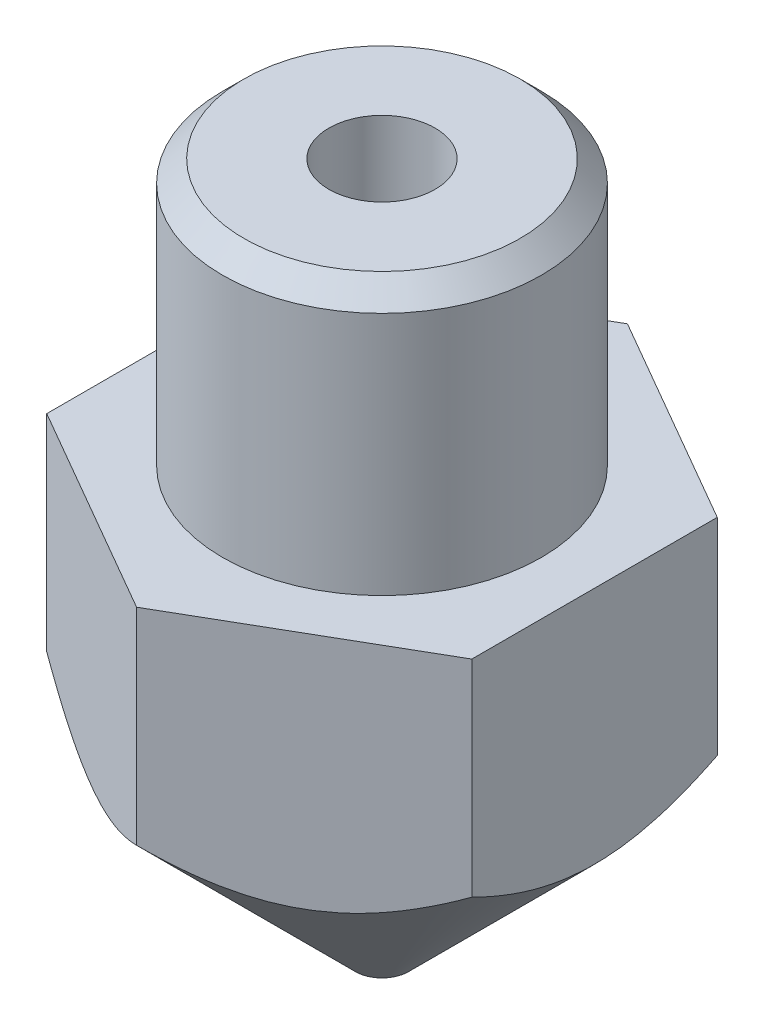
ISO-10303-21;
HEADER;
FILE_DESCRIPTION(('STEP AP214'),'2;1');
FILE_NAME('part.step','',(''),(''),'','','');
FILE_SCHEMA(('AUTOMOTIVE_DESIGN { 1 0 10303 214 1 1 1 1 }'));
ENDSEC;
DATA;
#1=APPLICATION_CONTEXT('core data for automotive mechanical design processes');
#2=APPLICATION_PROTOCOL_DEFINITION('international standard','automotive_design',2000,#1);
#3=PRODUCT_CONTEXT('',#1,'mechanical');
#4=PRODUCT('Part','Part','',(#3));
#5=PRODUCT_RELATED_PRODUCT_CATEGORY('part','',(#4));
#6=PRODUCT_DEFINITION_FORMATION('','',#4);
#7=PRODUCT_DEFINITION_CONTEXT('part definition',#1,'design');
#8=PRODUCT_DEFINITION('design','',#6,#7);
#9=PRODUCT_DEFINITION_SHAPE('','',#8);
#10=(LENGTH_UNIT() NAMED_UNIT(*) SI_UNIT(.MILLI.,.METRE.));
#11=(NAMED_UNIT(*) PLANE_ANGLE_UNIT() SI_UNIT($,.RADIAN.));
#12=(NAMED_UNIT(*) SI_UNIT($,.STERADIAN.) SOLID_ANGLE_UNIT());
#13=UNCERTAINTY_MEASURE_WITH_UNIT(LENGTH_MEASURE(1.E-05),#10,'distance_accuracy_value','');
#14=(GEOMETRIC_REPRESENTATION_CONTEXT(3) GLOBAL_UNCERTAINTY_ASSIGNED_CONTEXT((#13)) GLOBAL_UNIT_ASSIGNED_CONTEXT((#10,
#11,#12)) REPRESENTATION_CONTEXT('',''));
#15=CARTESIAN_POINT('',(0.,0.,0.));
#16=DIRECTION('',(0.,0.,1.));
#17=DIRECTION('',(1.,0.,0.));
#18=AXIS2_PLACEMENT_3D('',#15,#16,#17);
#19=CARTESIAN_POINT('',(0.,0.,0.));
#20=DIRECTION('',(0.,-1.,0.));
#21=DIRECTION('',(0.,0.,-1.));
#22=AXIS2_PLACEMENT_3D('',#19,#20,#21);
#23=PLANE('',#22);
#24=CARTESIAN_POINT('',(0.,0.,0.));
#25=DIRECTION('',(0.,1.,0.));
#26=DIRECTION('',(0.,0.,1.));
#27=AXIS2_PLACEMENT_3D('',#24,#25,#26);
#28=CIRCLE('',#27,0.2);
#29=CARTESIAN_POINT('',(0.,0.,0.2));
#30=VERTEX_POINT('',#29);
#31=EDGE_CURVE('E93',#30,#30,#28,.T.);
#32=ORIENTED_EDGE('',*,*,#31,.T.);
#33=EDGE_LOOP('',(#32));
#34=FACE_BOUND('',#33,.T.);
#35=CARTESIAN_POINT('',(0.,0.,0.));
#36=DIRECTION('',(0.,1.,0.));
#37=DIRECTION('',(0.,0.,1.));
#38=AXIS2_PLACEMENT_3D('',#35,#36,#37);
#39=CIRCLE('',#38,0.5);
#40=CARTESIAN_POINT('',(0.,0.,0.5));
#41=VERTEX_POINT('',#40);
#42=EDGE_CURVE('E76',#41,#41,#39,.T.);
#43=ORIENTED_EDGE('',*,*,#42,.F.);
#44=EDGE_LOOP('',(#43));
#45=FACE_BOUND('',#44,.T.);
#46=ADVANCED_FACE('F17',(#34,#45),#23,.T.);
#47=CARTESIAN_POINT('',(0.,13.,0.));
#48=DIRECTION('',(0.,-1.,0.));
#49=DIRECTION('',(0.,0.,-1.));
#50=AXIS2_PLACEMENT_3D('',#47,#48,#49);
#51=CYLINDRICAL_SURFACE('',#50,0.2);
#52=ORIENTED_EDGE('',*,*,#31,.F.);
#53=EDGE_LOOP('',(#52));
#54=FACE_BOUND('',#53,.T.);
#55=CARTESIAN_POINT('',(0.,2.,0.));
#56=DIRECTION('',(0.,1.,0.));
#57=DIRECTION('',(0.,0.,1.));
#58=AXIS2_PLACEMENT_3D('',#55,#56,#57);
#59=CIRCLE('',#58,0.2);
#60=CARTESIAN_POINT('',(0.,2.,0.2));
#61=VERTEX_POINT('',#60);
#62=EDGE_CURVE('E106',#61,#61,#59,.T.);
#63=ORIENTED_EDGE('',*,*,#62,.T.);
#64=EDGE_LOOP('',(#63));
#65=FACE_BOUND('',#64,.T.);
#66=ADVANCED_FACE('F128',(#54,#65),#51,.F.);
#67=CARTESIAN_POINT('',(0.,13.,0.));
#68=DIRECTION('',(0.,-1.,0.));
#69=DIRECTION('',(0.,0.,-1.));
#70=AXIS2_PLACEMENT_3D('',#67,#68,#69);
#71=PLANE('',#70);
#72=CARTESIAN_POINT('',(0.,13.,0.));
#73=DIRECTION('',(0.,-1.,0.));
#74=DIRECTION('',(0.,0.,-1.));
#75=AXIS2_PLACEMENT_3D('',#72,#73,#74);
#76=CIRCLE('',#75,2.6);
#77=CARTESIAN_POINT('',(0.,13.,-2.6));
#78=VERTEX_POINT('',#77);
#79=EDGE_CURVE('E25',#78,#78,#76,.F.);
#80=ORIENTED_EDGE('',*,*,#79,.T.);
#81=EDGE_LOOP('',(#80));
#82=FACE_BOUND('',#81,.T.);
#83=CARTESIAN_POINT('',(0.,13.,0.));
#84=DIRECTION('',(0.,1.,0.));
#85=DIRECTION('',(0.,0.,1.));
#86=AXIS2_PLACEMENT_3D('',#83,#84,#85);
#87=CIRCLE('',#86,1.);
#88=CARTESIAN_POINT('',(0.,13.,1.));
#89=VERTEX_POINT('',#88);
#90=EDGE_CURVE('E219',#89,#89,#87,.T.);
#91=ORIENTED_EDGE('',*,*,#90,.F.);
#92=EDGE_LOOP('',(#91));
#93=FACE_BOUND('',#92,.T.);
#94=ADVANCED_FACE('F113',(#82,#93),#71,.F.);
#95=CARTESIAN_POINT('',(-4.,13.,-2.30940107675851));
#96=DIRECTION('',(0.5,0.,0.866025403784439));
#97=DIRECTION('',(0.866025403784439,0.,-0.5));
#98=AXIS2_PLACEMENT_3D('',#95,#96,#97);
#99=PLANE('',#98);
#100=DIRECTION('',(0.,-1.,0.));
#101=VECTOR('',#100,1.);
#102=CARTESIAN_POINT('',(0.,13.,-4.61880215351701));
#103=LINE('',#102,#101);
#104=CARTESIAN_POINT('',(0.,8.,-4.61880215351701));
#105=VERTEX_POINT('',#104);
#106=CARTESIAN_POINT('',(0.,4.11880215351704,-4.61880215351701));
#107=VERTEX_POINT('',#106);
#108=EDGE_CURVE('E89',#105,#107,#103,.T.);
#109=ORIENTED_EDGE('',*,*,#108,.T.);
#110=CARTESIAN_POINT('',(0.000200000000000108,4.1189176279009,-4.61891762357084));
#111=CARTESIAN_POINT('',(-0.0685809847183842,4.0792110094746,-4.57920690352856));
#112=CARTESIAN_POINT('',(-0.137888304896502,4.0407225706302,-4.53919230356691));
#113=CARTESIAN_POINT('',(-0.277664036763594,3.96655337725255,-4.45849274714727));
#114=CARTESIAN_POINT('',(-0.348133057578704,3.93087415624869,-4.41780743901014));
#115=CARTESIAN_POINT('',(-0.562100081603899,3.82830302116804,-4.29427352009148));
#116=CARTESIAN_POINT('',(-0.70741658926774,3.76631526452961,-4.21037499527407));
#117=CARTESIAN_POINT('',(-1.00040214981325,3.66015802252645,-4.04121970302445));
#118=CARTESIAN_POINT('',(-1.14799719663763,3.61572120897048,-3.95600566300933));
#119=CARTESIAN_POINT('',(-1.44644641508885,3.54725113564649,-3.78369592639709));
#120=CARTESIAN_POINT('',(-1.59729144640342,3.52316679137835,-3.6966055069617));
#121=CARTESIAN_POINT('',(-1.85726690511354,3.50143703437757,-3.54650860589272));
#122=CARTESIAN_POINT('',(-1.96606238220551,3.4982210681579,-3.48369550790706));
#123=CARTESIAN_POINT('',(-2.18347675426331,3.50364221174204,-3.3581712616738));
#124=CARTESIAN_POINT('',(-2.29209557396633,3.51228347668887,-3.2954601568792));
#125=CARTESIAN_POINT('',(-2.50830402737813,3.54092619201347,-3.17063214810082));
#126=CARTESIAN_POINT('',(-2.6158923729203,3.5609403480683,-3.10851598784038));
#127=CARTESIAN_POINT('',(-2.82922129322131,3.61123631088169,-2.98535047827866));
#128=CARTESIAN_POINT('',(-2.93496200899961,3.6415173303954,-2.92430104755976));
#129=CARTESIAN_POINT('',(-3.12267722089173,3.70381740621126,-2.81592361944286));
#130=CARTESIAN_POINT('',(-3.20506731843128,3.73419843337714,-2.76835567444984));
#131=CARTESIAN_POINT('',(-3.36836846204127,3.79985661807737,-2.67407371522763));
#132=CARTESIAN_POINT('',(-3.44927946303274,3.83513392455681,-2.62735972702481));
#133=CARTESIAN_POINT('',(-3.60936749601012,3.90979384053796,-2.53493285809128));
#134=CARTESIAN_POINT('',(-3.68854908118623,3.94916354052064,-2.48921734857499));
#135=CARTESIAN_POINT('',(-3.84544590098815,4.03149126166034,-2.39863292742736));
#136=CARTESIAN_POINT('',(-3.92316199986076,4.074447081319,-2.35376351682289));
#137=CARTESIAN_POINT('',(-4.0002,4.1189176279009,-2.30928560670467));
#138=B_SPLINE_CURVE_WITH_KNOTS('',3,(#110,#111,#112,#113,#114,#115,#116,#117,#118,#119,#120,
#121,#122,#123,#124,#125,#126,#127,#128,#129,#130,#131,#132,#133,#134,#135,#136,#137),
.UNSPECIFIED.,.F.,.F.,(4,2,2,2,2,2,2,2,2,2,2,2,2,4),(0.,0.266361961703661,0.532868334400107,
1.06875865685461,1.59613884594049,2.12219135055578,2.49866160599655,2.87526382203491,
3.25228760372072,3.62928248242853,3.92874944437158,4.22822551811343,4.52678401907572,
4.82516056577922),.UNSPECIFIED.);
#139=CARTESIAN_POINT('',(-4.,4.11880215351705,-2.30940107675851));
#140=VERTEX_POINT('',#139);
#141=EDGE_CURVE('E32',#107,#140,#138,.T.);
#142=ORIENTED_EDGE('',*,*,#141,.T.);
#143=DIRECTION('',(0.,-1.,0.));
#144=VECTOR('',#143,1.);
#145=CARTESIAN_POINT('',(-4.,13.,-2.30940107675851));
#146=LINE('',#145,#144);
#147=CARTESIAN_POINT('',(-4.,8.,-2.30940107675851));
#148=VERTEX_POINT('',#147);
#149=EDGE_CURVE('E102',#148,#140,#146,.T.);
#150=ORIENTED_EDGE('',*,*,#149,.F.);
#151=DIRECTION('',(-0.866025403784439,0.,0.5));
#152=VECTOR('',#151,1.);
#153=CARTESIAN_POINT('',(-4.,8.,-2.30940107675851));
#154=LINE('',#153,#152);
#155=EDGE_CURVE('E206',#105,#148,#154,.T.);
#156=ORIENTED_EDGE('',*,*,#155,.F.);
#157=EDGE_LOOP('',(#109,#142,#150,#156));
#158=FACE_BOUND('',#157,.T.);
#159=ADVANCED_FACE('F194',(#158),#99,.F.);
#160=CARTESIAN_POINT('',(-4.,13.,2.30940107675851));
#161=DIRECTION('',(1.,0.,0.));
#162=DIRECTION('',(0.,0.,-1.));
#163=AXIS2_PLACEMENT_3D('',#160,#161,#162);
#164=PLANE('',#163);
#165=ORIENTED_EDGE('',*,*,#149,.T.);
#166=CARTESIAN_POINT('',(-4.,5.73212685783969,-4.77905902581315));
#167=CARTESIAN_POINT('',(-4.,5.64346748596165,-4.66341681351557));
#168=CARTESIAN_POINT('',(-4.,5.55561403003754,-4.54714679327309));
#169=CARTESIAN_POINT('',(-4.,5.38188587929106,-4.31309610010589));
#170=CARTESIAN_POINT('',(-4.,5.29601166343471,-4.19531507203947));
#171=CARTESIAN_POINT('',(-4.,5.12599739733398,-3.9571257396594));
#172=CARTESIAN_POINT('',(-4.,5.0418758758063,-3.83670416626529));
#173=CARTESIAN_POINT('',(-4.,4.87659984301568,-3.59384843928744));
#174=CARTESIAN_POINT('',(-4.,4.79544512616878,-3.47141442601073));
#175=CARTESIAN_POINT('',(-4.,4.63187517586531,-3.21656312283127));
#176=CARTESIAN_POINT('',(-4.,4.54969172736732,-3.08399631610252));
#177=CARTESIAN_POINT('',(-4.,4.39048127201808,-2.81575276837489));
#178=CARTESIAN_POINT('',(-4.,4.3134551232434,-2.68007551487303));
#179=CARTESIAN_POINT('',(-4.,4.16620368537939,-2.4055838563434));
#180=CARTESIAN_POINT('',(-4.,4.09595840271948,-2.26678026140735));
#181=CARTESIAN_POINT('',(-4.,3.96384154707825,-1.98527514032603));
#182=CARTESIAN_POINT('',(-4.,3.90196605335381,-1.84257547716921));
#183=CARTESIAN_POINT('',(-4.,3.79426748738592,-1.56691788081979));
#184=CARTESIAN_POINT('',(-4.,3.74747278057091,-1.43434346133054));
#185=CARTESIAN_POINT('',(-4.,3.66448474989008,-1.16585451327911));
#186=CARTESIAN_POINT('',(-4.,3.62829215820013,-1.02993975473727));
#187=CARTESIAN_POINT('',(-4.,3.56898686102959,-0.757625363404519));
#188=CARTESIAN_POINT('',(-4.,3.54566508544814,-0.621272042720492));
#189=CARTESIAN_POINT('',(-4.,3.51270815432858,-0.346911453059013));
#190=CARTESIAN_POINT('',(-4.,3.50307033637104,-0.208904511089297));
#191=CARTESIAN_POINT('',(-4.,3.49827528438003,0.062073821858934));
#192=CARTESIAN_POINT('',(-4.,3.50257785017769,0.195035741573042));
#193=CARTESIAN_POINT('',(-4.,3.52418510166238,0.4598867626557));
#194=CARTESIAN_POINT('',(-4.,3.54149052355676,0.591775802851583));
#195=CARTESIAN_POINT('',(-4.,3.58816816819446,0.85437482385213));
#196=CARTESIAN_POINT('',(-4.,3.61762914464305,0.985068749309125));
#197=CARTESIAN_POINT('',(-4.,3.68701276021437,1.24362530245088));
#198=CARTESIAN_POINT('',(-4.,3.72693691632218,1.37148751666752));
#199=CARTESIAN_POINT('',(-4.,3.81709485704615,1.62859536990242));
#200=CARTESIAN_POINT('',(-4.,3.86764426442316,1.75772903837643));
#201=CARTESIAN_POINT('',(-4.,3.97636756473486,2.01275438408487));
#202=CARTESIAN_POINT('',(-4.,4.03454366700993,2.13864510919394));
#203=CARTESIAN_POINT('',(-4.,4.15712259534762,2.38758165383251));
#204=CARTESIAN_POINT('',(-4.,4.2215351467031,2.5106226468003));
#205=CARTESIAN_POINT('',(-4.,4.35529924673647,2.75395302464388));
#206=CARTESIAN_POINT('',(-4.,4.42465018836096,2.87424274532728));
#207=CARTESIAN_POINT('',(-4.,4.56831466060003,3.1140247922674));
#208=CARTESIAN_POINT('',(-4.,4.64268259185649,3.23348437207579));
#209=CARTESIAN_POINT('',(-4.,4.794756109852,3.4702553792479));
#210=CARTESIAN_POINT('',(-4.,4.87246177633546,3.58756675519159));
#211=CARTESIAN_POINT('',(-4.,5.03052948527013,3.82021418468168));
#212=CARTESIAN_POINT('',(-4.,5.11088887446172,3.93555204606754));
#213=CARTESIAN_POINT('',(-4.,5.27386538493033,4.1646102705681));
#214=CARTESIAN_POINT('',(-4.,5.35648242170162,4.2783306939833));
#215=CARTESIAN_POINT('',(-4.,5.62980974565354,4.64807586270745));
#216=CARTESIAN_POINT('',(-4.,5.82441597800312,4.90122098074825));
#217=CARTESIAN_POINT('',(-4.,6.22023009988955,5.40231197114792));
#218=CARTESIAN_POINT('',(-4.,6.42143905454643,5.65025699397256));
#219=CARTESIAN_POINT('',(-4.,6.8286689622327,6.14234994767946));
#220=CARTESIAN_POINT('',(-4.,7.03469213318383,6.38649603852143));
#221=CARTESIAN_POINT('',(-4.,7.45022289866151,6.87180677693061));
#222=CARTESIAN_POINT('',(-4.,7.65973058790859,7.11297134313862));
#223=CARTESIAN_POINT('',(-4.,8.08185361257717,7.59351163501746));
#224=CARTESIAN_POINT('',(-4.,8.29447481907765,7.83288219480795));
#225=CARTESIAN_POINT('',(-4.,8.72178068531693,8.30977751165472));
#226=CARTESIAN_POINT('',(-4.,8.93646537367911,8.54730224302392));
#227=CARTESIAN_POINT('',(-4.,9.58281131389398,9.25753011829033));
#228=CARTESIAN_POINT('',(-4.,10.0168917424732,9.72803071631379));
#229=CARTESIAN_POINT('',(-4.,10.8377967435924,10.6098130281305));
#230=CARTESIAN_POINT('',(-4.,11.2241537813373,11.0215317049868));
#231=CARTESIAN_POINT('',(-4.,11.9992911843683,11.8427479911262));
#232=CARTESIAN_POINT('',(-4.,12.3880717559541,12.2522454056219));
#233=CARTESIAN_POINT('',(-4.,13.1658170113698,13.0678850966285));
#234=CARTESIAN_POINT('',(-4.,13.5547744970667,13.4740342453212));
#235=CARTESIAN_POINT('',(-4.,14.3340215051503,14.2849739241238));
#236=CARTESIAN_POINT('',(-4.,14.7243108885254,14.6897645877709));
#237=CARTESIAN_POINT('',(-4.,15.1150933888183,15.0940763725878));
#238=B_SPLINE_CURVE_WITH_KNOTS('',3,(#166,#167,#168,#169,#170,#171,#172,#173,#174,#175,#176,
#177,#178,#179,#180,#181,#182,#183,#184,#185,#186,#187,#188,#189,#190,#191,#192,#193,#194,#195,
#196,#197,#198,#199,#200,#201,#202,#203,#204,#205,#206,#207,#208,#209,#210,#211,#212,#213,#214,
#215,#216,#217,#218,#219,#220,#221,#222,#223,#224,#225,#226,#227,#228,#229,#230,#231,#232,#233,
#234,#235,#236,#237),.UNSPECIFIED.,.F.,.F.,(4,2,2,2,2,2,2,2,2,2,2,2,2,2,2,2,2,2,2,2,2,2,2,2,2,2,
2,2,2,2,2,2,2,2,2,4),(0.,0.43716080543372,0.874426313787479,1.315070796643,1.75568468705109,
2.22351522596084,2.69142341053533,3.15790687815101,3.62417106390509,4.04557898581036,
4.46701600304357,4.8813891101,5.29568158359364,5.69411475207111,6.09257048109452,
6.49398851492953,6.89546477985553,7.31119051798641,7.72703695291433,8.1435426480817,
8.55999723222807,8.98208000635885,9.40417287041268,9.82585578389272,10.2475229349746,
11.2052433127367,12.1631189523436,13.1214449446704,14.0797970301274,15.0402787007943,
16.0007737139602,17.9211877004753,19.6150071074664,21.3089727227519,22.9960395060508,
24.6829352878233),.UNSPECIFIED.);
#239=CARTESIAN_POINT('',(-4.,4.11880215351704,2.30940107675851));
#240=VERTEX_POINT('',#239);
#241=EDGE_CURVE('E178',#140,#240,#238,.T.);
#242=ORIENTED_EDGE('',*,*,#241,.T.);
#243=DIRECTION('',(0.,-1.,0.));
#244=VECTOR('',#243,1.);
#245=CARTESIAN_POINT('',(-4.,13.,2.30940107675851));
#246=LINE('',#245,#244);
#247=CARTESIAN_POINT('',(-4.,8.,2.30940107675851));
#248=VERTEX_POINT('',#247);
#249=EDGE_CURVE('E99',#248,#240,#246,.T.);
#250=ORIENTED_EDGE('',*,*,#249,.F.);
#251=DIRECTION('',(0.,0.,1.));
#252=VECTOR('',#251,1.);
#253=CARTESIAN_POINT('',(-4.,8.,2.30940107675851));
#254=LINE('',#253,#252);
#255=EDGE_CURVE('E208',#148,#248,#254,.T.);
#256=ORIENTED_EDGE('',*,*,#255,.F.);
#257=EDGE_LOOP('',(#165,#242,#250,#256));
#258=FACE_BOUND('',#257,.T.);
#259=ADVANCED_FACE('F190',(#258),#164,.F.);
#260=CARTESIAN_POINT('',(0.,13.,4.61880215351701));
#261=DIRECTION('',(0.5,0.,-0.866025403784439));
#262=DIRECTION('',(-0.866025403784439,0.,-0.5));
#263=AXIS2_PLACEMENT_3D('',#260,#261,#262);
#264=PLANE('',#263);
#265=ORIENTED_EDGE('',*,*,#249,.T.);
#266=CARTESIAN_POINT('',(-4.0002,4.1189176279009,2.30928560670467));
#267=CARTESIAN_POINT('',(-3.93141901528162,4.07921100947461,2.34899632674695));
#268=CARTESIAN_POINT('',(-3.8621116951035,4.0407225706302,2.3890109267086));
#269=CARTESIAN_POINT('',(-3.72233596323641,3.96655337725256,2.46971048312825));
#270=CARTESIAN_POINT('',(-3.6518669424213,3.93087415624869,2.51039579126538));
#271=CARTESIAN_POINT('',(-3.4378999183961,3.82830302116804,2.63392971018403));
#272=CARTESIAN_POINT('',(-3.29258341073226,3.76631526452961,2.71782823500144));
#273=CARTESIAN_POINT('',(-2.99959785018676,3.66015802252645,2.88698352725106));
#274=CARTESIAN_POINT('',(-2.85200280336237,3.61572120897048,2.97219756726618));
#275=CARTESIAN_POINT('',(-2.55355358491115,3.54725113564649,3.14450730387843));
#276=CARTESIAN_POINT('',(-2.40270855359658,3.52316679137835,3.23159772331381));
#277=CARTESIAN_POINT('',(-2.14273309488646,3.50143703437757,3.38169462438279));
#278=CARTESIAN_POINT('',(-2.03393761779449,3.4982210681579,3.44450772236845));
#279=CARTESIAN_POINT('',(-1.8165232457367,3.50364221174204,3.57003196860172));
#280=CARTESIAN_POINT('',(-1.70790442603367,3.51228347668887,3.63274307339632));
#281=CARTESIAN_POINT('',(-1.49169597262187,3.54092619201347,3.75757108217469));
#282=CARTESIAN_POINT('',(-1.3841076270797,3.5609403480683,3.81968724243513));
#283=CARTESIAN_POINT('',(-1.17077870677869,3.61123631088169,3.94285275199685));
#284=CARTESIAN_POINT('',(-1.06503799100039,3.6415173303954,4.00390218271575));
#285=CARTESIAN_POINT('',(-0.877322779108275,3.70381740621126,4.11227961083265));
#286=CARTESIAN_POINT('',(-0.794932681568723,3.73419843337714,4.15984755582568));
#287=CARTESIAN_POINT('',(-0.631631537958734,3.79985661807737,4.25412951504788));
#288=CARTESIAN_POINT('',(-0.550720536967263,3.83513392455681,4.30084350325071));
#289=CARTESIAN_POINT('',(-0.390632503989885,3.90979384053796,4.39327037218423));
#290=CARTESIAN_POINT('',(-0.311450918813777,3.94916354052064,4.43898588170052));
#291=CARTESIAN_POINT('',(-0.154554099011854,4.03149126166034,4.52957030284816));
#292=CARTESIAN_POINT('',(-0.0768380001392404,4.074447081319,4.57443971345262));
#293=CARTESIAN_POINT('',(0.000199999999999558,4.1189176279009,4.61891762357084));
#294=B_SPLINE_CURVE_WITH_KNOTS('',3,(#266,#267,#268,#269,#270,#271,#272,#273,#274,#275,#276,
#277,#278,#279,#280,#281,#282,#283,#284,#285,#286,#287,#288,#289,#290,#291,#292,#293),
.UNSPECIFIED.,.F.,.F.,(4,2,2,2,2,2,2,2,2,2,2,2,2,4),(0.,0.266361961703661,0.532868334400106,
1.06875865685461,1.59613884594049,2.12219135055578,2.49866160599655,2.87526382203491,
3.25228760372073,3.62928248242853,3.92874944437157,4.22822551811343,4.52678401907572,
4.82516056577921),.UNSPECIFIED.);
#295=CARTESIAN_POINT('',(0.,4.11880215351705,4.61880215351701));
#296=VERTEX_POINT('',#295);
#297=EDGE_CURVE('E171',#240,#296,#294,.T.);
#298=ORIENTED_EDGE('',*,*,#297,.T.);
#299=DIRECTION('',(0.,-1.,0.));
#300=VECTOR('',#299,1.);
#301=CARTESIAN_POINT('',(0.,13.,4.61880215351701));
#302=LINE('',#301,#300);
#303=CARTESIAN_POINT('',(0.,8.,4.61880215351701));
#304=VERTEX_POINT('',#303);
#305=EDGE_CURVE('E91',#304,#296,#302,.T.);
#306=ORIENTED_EDGE('',*,*,#305,.F.);
#307=DIRECTION('',(0.866025403784439,0.,0.5));
#308=VECTOR('',#307,1.);
#309=CARTESIAN_POINT('',(0.,8.,4.61880215351701));
#310=LINE('',#309,#308);
#311=EDGE_CURVE('E210',#248,#304,#310,.T.);
#312=ORIENTED_EDGE('',*,*,#311,.F.);
#313=EDGE_LOOP('',(#265,#298,#306,#312));
#314=FACE_BOUND('',#313,.T.);
#315=ADVANCED_FACE('F193',(#314),#264,.F.);
#316=CARTESIAN_POINT('',(4.,13.,2.30940107675851));
#317=DIRECTION('',(-0.5,0.,-0.866025403784439));
#318=DIRECTION('',(-0.866025403784439,0.,0.5));
#319=AXIS2_PLACEMENT_3D('',#316,#317,#318);
#320=PLANE('',#319);
#321=ORIENTED_EDGE('',*,*,#305,.T.);
#322=CARTESIAN_POINT('',(-0.000200000000000433,4.1189176279009,4.61891762357084));
#323=CARTESIAN_POINT('',(0.068580984718384,4.0792110094746,4.57920690352856));
#324=CARTESIAN_POINT('',(0.137888304896502,4.0407225706302,4.53919230356691));
#325=CARTESIAN_POINT('',(0.277664036763594,3.96655337725255,4.45849274714727));
#326=CARTESIAN_POINT('',(0.348133057578704,3.93087415624869,4.41780743901014));
#327=CARTESIAN_POINT('',(0.562100081603899,3.82830302116804,4.29427352009148));
#328=CARTESIAN_POINT('',(0.70741658926774,3.76631526452961,4.21037499527407));
#329=CARTESIAN_POINT('',(1.00040214981325,3.66015802252645,4.04121970302445));
#330=CARTESIAN_POINT('',(1.14799719663763,3.61572120897048,3.95600566300933));
#331=CARTESIAN_POINT('',(1.44644641508885,3.54725113564649,3.78369592639709));
#332=CARTESIAN_POINT('',(1.59729144640342,3.52316679137835,3.6966055069617));
#333=CARTESIAN_POINT('',(1.85726690511354,3.50143703437757,3.54650860589272));
#334=CARTESIAN_POINT('',(1.96606238220551,3.4982210681579,3.48369550790706));
#335=CARTESIAN_POINT('',(2.18347675426331,3.50364221174204,3.3581712616738));
#336=CARTESIAN_POINT('',(2.29209557396633,3.51228347668887,3.2954601568792));
#337=CARTESIAN_POINT('',(2.50830402737813,3.54092619201347,3.17063214810082));
#338=CARTESIAN_POINT('',(2.6158923729203,3.5609403480683,3.10851598784038));
#339=CARTESIAN_POINT('',(2.82922129322131,3.61123631088169,2.98535047827866));
#340=CARTESIAN_POINT('',(2.93496200899961,3.6415173303954,2.92430104755976));
#341=CARTESIAN_POINT('',(3.12267722089173,3.70381740621126,2.81592361944286));
#342=CARTESIAN_POINT('',(3.20506731843128,3.73419843337714,2.76835567444984));
#343=CARTESIAN_POINT('',(3.36836846204127,3.79985661807737,2.67407371522763));
#344=CARTESIAN_POINT('',(3.44927946303274,3.83513392455682,2.62735972702481));
#345=CARTESIAN_POINT('',(3.60936749601012,3.90979384053796,2.53493285809128));
#346=CARTESIAN_POINT('',(3.68854908118623,3.94916354052064,2.48921734857499));
#347=CARTESIAN_POINT('',(3.84544590098815,4.03149126166034,2.39863292742736));
#348=CARTESIAN_POINT('',(3.92316199986076,4.074447081319,2.35376351682289));
#349=CARTESIAN_POINT('',(4.0002,4.1189176279009,2.30928560670467));
#350=B_SPLINE_CURVE_WITH_KNOTS('',3,(#322,#323,#324,#325,#326,#327,#328,#329,#330,#331,#332,
#333,#334,#335,#336,#337,#338,#339,#340,#341,#342,#343,#344,#345,#346,#347,#348,#349),
.UNSPECIFIED.,.F.,.F.,(4,2,2,2,2,2,2,2,2,2,2,2,2,4),(0.,0.266361961703661,0.532868334400107,
1.06875865685461,1.59613884594049,2.12219135055578,2.49866160599655,2.87526382203491,
3.25228760372072,3.62928248242853,3.92874944437158,4.22822551811343,4.52678401907572,
4.82516056577922),.UNSPECIFIED.);
#351=CARTESIAN_POINT('',(4.,4.11880215351705,2.30940107675851));
#352=VERTEX_POINT('',#351);
#353=EDGE_CURVE('E85',#296,#352,#350,.T.);
#354=ORIENTED_EDGE('',*,*,#353,.T.);
#355=DIRECTION('',(0.,-1.,0.));
#356=VECTOR('',#355,1.);
#357=CARTESIAN_POINT('',(4.,13.,2.30940107675851));
#358=LINE('',#357,#356);
#359=CARTESIAN_POINT('',(4.,8.,2.30940107675851));
#360=VERTEX_POINT('',#359);
#361=EDGE_CURVE('E84',#360,#352,#358,.T.);
#362=ORIENTED_EDGE('',*,*,#361,.F.);
#363=DIRECTION('',(0.866025403784439,0.,-0.5));
#364=VECTOR('',#363,1.);
#365=CARTESIAN_POINT('',(4.,8.,2.30940107675851));
#366=LINE('',#365,#364);
#367=EDGE_CURVE('E214',#304,#360,#366,.T.);
#368=ORIENTED_EDGE('',*,*,#367,.F.);
#369=EDGE_LOOP('',(#321,#354,#362,#368));
#370=FACE_BOUND('',#369,.T.);
#371=ADVANCED_FACE('F316',(#370),#320,.F.);
#372=CARTESIAN_POINT('',(4.,13.,-2.30940107675851));
#373=DIRECTION('',(-1.,0.,0.));
#374=DIRECTION('',(0.,0.,1.));
#375=AXIS2_PLACEMENT_3D('',#372,#373,#374);
#376=PLANE('',#375);
#377=ORIENTED_EDGE('',*,*,#361,.T.);
#378=CARTESIAN_POINT('',(4.,5.73212685783394,-4.77905902580564));
#379=CARTESIAN_POINT('',(4.,5.64346748595613,-4.66341681350828));
#380=CARTESIAN_POINT('',(4.,5.55561403003224,-4.54714679326602));
#381=CARTESIAN_POINT('',(4.,5.3818858792862,-4.31309610009926));
#382=CARTESIAN_POINT('',(4.,5.29601166343007,-4.19531507203306));
#383=CARTESIAN_POINT('',(4.,5.12599739732979,-3.95712573965344));
#384=CARTESIAN_POINT('',(4.,5.04187587580233,-3.83670416625956));
#385=CARTESIAN_POINT('',(4.,4.87659984301216,-3.59384843928217));
#386=CARTESIAN_POINT('',(4.,4.79544512616548,-3.47141442600569));
#387=CARTESIAN_POINT('',(4.,4.63187517586247,-3.21656312282673));
#388=CARTESIAN_POINT('',(4.,4.54969172736471,-3.08399631609824));
#389=CARTESIAN_POINT('',(4.,4.39048127201593,-2.81575276837115));
#390=CARTESIAN_POINT('',(4.,4.31345512324148,-2.68007551486956));
#391=CARTESIAN_POINT('',(4.,4.16620368537789,-2.40558385634049));
#392=CARTESIAN_POINT('',(4.,4.09595840271818,-2.26678026140472));
#393=CARTESIAN_POINT('',(4.,3.96384154707735,-1.98527514032398));
#394=CARTESIAN_POINT('',(4.,3.90196605335309,-1.84257547716746));
#395=CARTESIAN_POINT('',(4.,3.79426748738532,-1.56691788081817));
#396=CARTESIAN_POINT('',(4.,3.74747278057029,-1.43434346132872));
#397=CARTESIAN_POINT('',(4.,3.66448474988946,-1.16585451327691));
#398=CARTESIAN_POINT('',(4.,3.62829215819952,-1.02993975473488));
#399=CARTESIAN_POINT('',(4.,3.56898686102907,-0.757625363401744));
#400=CARTESIAN_POINT('',(4.,3.54566508544768,-0.621272042717529));
#401=CARTESIAN_POINT('',(4.,3.51270815432828,-0.346911453055679));
#402=CARTESIAN_POINT('',(4.,3.50307033637086,-0.20890451108578));
#403=CARTESIAN_POINT('',(4.,3.49827528438009,0.0620738218627699));
#404=CARTESIAN_POINT('',(4.,3.50257785017788,0.195035741577015));
#405=CARTESIAN_POINT('',(4.,3.52418510166286,0.459886762659932));
#406=CARTESIAN_POINT('',(4.,3.54149052355739,0.591775802855936));
#407=CARTESIAN_POINT('',(4.,3.58816816819542,0.854374823856719));
#408=CARTESIAN_POINT('',(4.,3.61762914464417,0.985068749313828));
#409=CARTESIAN_POINT('',(4.,3.68701276021583,1.2436253024558));
#410=CARTESIAN_POINT('',(4.,3.72693691632381,1.37148751667254));
#411=CARTESIAN_POINT('',(4.,3.81709485704824,1.62859536990799));
#412=CARTESIAN_POINT('',(4.,3.86764426442556,1.75772903838244));
#413=CARTESIAN_POINT('',(4.,3.97636756473793,2.01275438409172));
#414=CARTESIAN_POINT('',(4.,4.03454366701335,2.1386451092012));
#415=CARTESIAN_POINT('',(4.,4.15712259535176,2.38758165384058));
#416=CARTESIAN_POINT('',(4.,4.2215351467076,2.51062264680877));
#417=CARTESIAN_POINT('',(4.,4.35529924674171,2.75395302465313));
#418=CARTESIAN_POINT('',(4.,4.42465018836658,2.87424274533692));
#419=CARTESIAN_POINT('',(4.,4.56831466060641,3.11402479227779));
#420=CARTESIAN_POINT('',(4.,4.64268259186326,3.23348437208656));
#421=CARTESIAN_POINT('',(4.,4.79475610985954,3.47025537925941));
#422=CARTESIAN_POINT('',(4.,4.8724617763434,3.58756675520347));
#423=CARTESIAN_POINT('',(4.,5.03052948527885,3.82021418469429));
#424=CARTESIAN_POINT('',(4.,5.11088887447082,3.93555204608052));
#425=CARTESIAN_POINT('',(4.,5.27386538494021,4.1646102705818));
#426=CARTESIAN_POINT('',(4.,5.3564824217119,4.27833069399737));
#427=CARTESIAN_POINT('',(4.,5.62980974566432,4.64807586272163));
#428=CARTESIAN_POINT('',(4.,5.82441597801396,4.90122098076221));
#429=CARTESIAN_POINT('',(4.,6.22023009990046,5.40231197116148));
#430=CARTESIAN_POINT('',(4.,6.42143905455735,5.65025699398593));
#431=CARTESIAN_POINT('',(4.,6.82866896224362,6.14234994769248));
#432=CARTESIAN_POINT('',(4.,7.03469213319473,6.38649603853428));
#433=CARTESIAN_POINT('',(4.,7.45022289867235,6.87180677694315));
#434=CARTESIAN_POINT('',(4.,7.6597305879194,7.11297134315101));
#435=CARTESIAN_POINT('',(4.,8.08185361258787,7.59351163502956));
#436=CARTESIAN_POINT('',(4.,8.29447481908829,7.8328821948199));
#437=CARTESIAN_POINT('',(4.,8.72178068532746,8.3097775116664));
#438=CARTESIAN_POINT('',(4.,8.93646537368956,8.54730224303546));
#439=CARTESIAN_POINT('',(4.,9.58281131390422,9.25753011830148));
#440=CARTESIAN_POINT('',(4.,10.0168917424833,9.72803071632469));
#441=CARTESIAN_POINT('',(4.,10.8377967436025,10.6098130281413));
#442=CARTESIAN_POINT('',(4.,11.2241537813476,11.0215317049977));
#443=CARTESIAN_POINT('',(4.,11.9992911843789,11.8427479911373));
#444=CARTESIAN_POINT('',(4.,12.3880717559648,12.2522454056332));
#445=CARTESIAN_POINT('',(4.,13.1658170113808,13.0678850966401));
#446=CARTESIAN_POINT('',(4.,13.5547744970779,13.4740342453329));
#447=CARTESIAN_POINT('',(4.,14.3340215051618,14.2849739241357));
#448=CARTESIAN_POINT('',(4.,14.7243108885371,14.6897645877831));
#449=CARTESIAN_POINT('',(4.,15.1150933888302,15.0940763726001));
#450=B_SPLINE_CURVE_WITH_KNOTS('',3,(#378,#379,#380,#381,#382,#383,#384,#385,#386,#387,#388,
#389,#390,#391,#392,#393,#394,#395,#396,#397,#398,#399,#400,#401,#402,#403,#404,#405,#406,#407,
#408,#409,#410,#411,#412,#413,#414,#415,#416,#417,#418,#419,#420,#421,#422,#423,#424,#425,#426,
#427,#428,#429,#430,#431,#432,#433,#434,#435,#436,#437,#438,#439,#440,#441,#442,#443,#444,#445,
#446,#447,#448,#449),.UNSPECIFIED.,.F.,.F.,(4,2,2,2,2,2,2,2,2,2,2,2,2,2,2,2,2,2,2,2,2,2,2,2,2,2,
2,2,2,2,2,2,2,2,2,4),(0.,0.437160805432792,0.874426313785621,1.3150707966402,1.75568468704734,
2.22351522595605,2.69142341052949,3.15790687814413,3.62417106389718,4.045578985803,
4.46701600303676,4.88138911009371,5.29568158358788,5.69411475206576,6.0925704810896,
6.49398851492506,6.8954647798515,7.31119051798394,7.72703695291342,8.14354264808236,
8.55999723223029,8.98208000636263,9.40417287041804,9.82585578389964,10.2475229349831,
11.2052433127447,12.1631189523513,13.1214449446776,14.0797970301343,15.0402787008007,
16.0007737139662,17.9211877004804,19.6150071074721,21.3089727227582,22.9960395060577,
24.682935287831),.UNSPECIFIED.);
#451=CARTESIAN_POINT('',(4.,4.11880215351704,-2.30940107675851));
#452=VERTEX_POINT('',#451);
#453=EDGE_CURVE('E70',#352,#452,#450,.F.);
#454=ORIENTED_EDGE('',*,*,#453,.T.);
#455=DIRECTION('',(0.,-1.,0.));
#456=VECTOR('',#455,1.);
#457=CARTESIAN_POINT('',(4.,13.,-2.30940107675851));
#458=LINE('',#457,#456);
#459=CARTESIAN_POINT('',(4.,8.,-2.30940107675851));
#460=VERTEX_POINT('',#459);
#461=EDGE_CURVE('E82',#460,#452,#458,.T.);
#462=ORIENTED_EDGE('',*,*,#461,.F.);
#463=DIRECTION('',(0.,0.,-1.));
#464=VECTOR('',#463,1.);
#465=CARTESIAN_POINT('',(4.,8.,-2.30940107675851));
#466=LINE('',#465,#464);
#467=EDGE_CURVE('E40',#360,#460,#466,.T.);
#468=ORIENTED_EDGE('',*,*,#467,.F.);
#469=EDGE_LOOP('',(#377,#454,#462,#468));
#470=FACE_BOUND('',#469,.T.);
#471=ADVANCED_FACE('F81',(#470),#376,.F.);
#472=CARTESIAN_POINT('',(0.,13.,-4.61880215351701));
#473=DIRECTION('',(-0.5,0.,0.866025403784439));
#474=DIRECTION('',(0.866025403784439,0.,0.5));
#475=AXIS2_PLACEMENT_3D('',#472,#473,#474);
#476=PLANE('',#475);
#477=ORIENTED_EDGE('',*,*,#461,.T.);
#478=CARTESIAN_POINT('',(4.0002,4.1189176279009,-2.30928560670467));
#479=CARTESIAN_POINT('',(3.93141901528162,4.07921100947461,-2.34899632674695));
#480=CARTESIAN_POINT('',(3.8621116951035,4.0407225706302,-2.3890109267086));
#481=CARTESIAN_POINT('',(3.72233596323641,3.96655337725256,-2.46971048312825));
#482=CARTESIAN_POINT('',(3.6518669424213,3.93087415624869,-2.51039579126538));
#483=CARTESIAN_POINT('',(3.4378999183961,3.82830302116804,-2.63392971018403));
#484=CARTESIAN_POINT('',(3.29258341073226,3.76631526452961,-2.71782823500144));
#485=CARTESIAN_POINT('',(2.99959785018676,3.66015802252645,-2.88698352725106));
#486=CARTESIAN_POINT('',(2.85200280336237,3.61572120897048,-2.97219756726618));
#487=CARTESIAN_POINT('',(2.55355358491115,3.54725113564649,-3.14450730387843));
#488=CARTESIAN_POINT('',(2.40270855359658,3.52316679137835,-3.23159772331381));
#489=CARTESIAN_POINT('',(2.14273309488646,3.50143703437757,-3.38169462438279));
#490=CARTESIAN_POINT('',(2.03393761779449,3.4982210681579,-3.44450772236845));
#491=CARTESIAN_POINT('',(1.8165232457367,3.50364221174204,-3.57003196860172));
#492=CARTESIAN_POINT('',(1.70790442603367,3.51228347668887,-3.63274307339632));
#493=CARTESIAN_POINT('',(1.49169597262187,3.54092619201347,-3.75757108217469));
#494=CARTESIAN_POINT('',(1.3841076270797,3.5609403480683,-3.81968724243513));
#495=CARTESIAN_POINT('',(1.17077870677869,3.61123631088169,-3.94285275199685));
#496=CARTESIAN_POINT('',(1.06503799100039,3.6415173303954,-4.00390218271575));
#497=CARTESIAN_POINT('',(0.877322779108273,3.70381740621126,-4.11227961083266));
#498=CARTESIAN_POINT('',(0.794932681568723,3.73419843337714,-4.15984755582568));
#499=CARTESIAN_POINT('',(0.631631537958733,3.79985661807737,-4.25412951504788));
#500=CARTESIAN_POINT('',(0.550720536967262,3.83513392455682,-4.30084350325071));
#501=CARTESIAN_POINT('',(0.390632503989885,3.90979384053796,-4.39327037218423));
#502=CARTESIAN_POINT('',(0.311450918813777,3.94916354052064,-4.43898588170052));
#503=CARTESIAN_POINT('',(0.154554099011854,4.03149126166034,-4.52957030284816));
#504=CARTESIAN_POINT('',(0.07683800013924,4.074447081319,-4.57443971345262));
#505=CARTESIAN_POINT('',(-0.000200000000000298,4.1189176279009,-4.61891762357084));
#506=B_SPLINE_CURVE_WITH_KNOTS('',3,(#478,#479,#480,#481,#482,#483,#484,#485,#486,#487,#488,
#489,#490,#491,#492,#493,#494,#495,#496,#497,#498,#499,#500,#501,#502,#503,#504,#505),
.UNSPECIFIED.,.F.,.F.,(4,2,2,2,2,2,2,2,2,2,2,2,2,4),(0.,0.266361961703661,0.532868334400107,
1.06875865685461,1.59613884594049,2.12219135055578,2.49866160599655,2.87526382203491,
3.25228760372073,3.62928248242853,3.92874944437157,4.22822551811343,4.52678401907572,
4.82516056577922),.UNSPECIFIED.);
#507=EDGE_CURVE('E67',#452,#107,#506,.T.);
#508=ORIENTED_EDGE('',*,*,#507,.T.);
#509=ORIENTED_EDGE('',*,*,#108,.F.);
#510=DIRECTION('',(-0.866025403784439,0.,-0.5));
#511=VECTOR('',#510,1.);
#512=CARTESIAN_POINT('',(0.,8.,-4.61880215351701));
#513=LINE('',#512,#511);
#514=EDGE_CURVE('E88',#460,#105,#513,.T.);
#515=ORIENTED_EDGE('',*,*,#514,.F.);
#516=EDGE_LOOP('',(#477,#508,#509,#515));
#517=FACE_BOUND('',#516,.T.);
#518=ADVANCED_FACE('F87',(#517),#476,.F.);
#519=CARTESIAN_POINT('',(0.,8.,0.));
#520=DIRECTION('',(0.,1.,0.));
#521=DIRECTION('',(0.,0.,1.));
#522=AXIS2_PLACEMENT_3D('',#519,#520,#521);
#523=PLANE('',#522);
#524=CARTESIAN_POINT('',(0.,8.,0.));
#525=DIRECTION('',(0.,1.,0.));
#526=DIRECTION('',(0.,0.,1.));
#527=AXIS2_PLACEMENT_3D('',#524,#525,#526);
#528=CIRCLE('',#527,3.);
#529=CARTESIAN_POINT('',(0.,8.,3.));
#530=VERTEX_POINT('',#529);
#531=EDGE_CURVE('E108',#530,#530,#528,.T.);
#532=ORIENTED_EDGE('',*,*,#531,.F.);
#533=EDGE_LOOP('',(#532));
#534=FACE_BOUND('',#533,.T.);
#535=ORIENTED_EDGE('',*,*,#155,.T.);
#536=ORIENTED_EDGE('',*,*,#255,.T.);
#537=ORIENTED_EDGE('',*,*,#311,.T.);
#538=ORIENTED_EDGE('',*,*,#367,.T.);
#539=ORIENTED_EDGE('',*,*,#467,.T.);
#540=ORIENTED_EDGE('',*,*,#514,.T.);
#541=EDGE_LOOP('',(#535,#536,#537,#538,#539,#540));
#542=FACE_BOUND('',#541,.T.);
#543=ADVANCED_FACE('F144',(#534,#542),#523,.T.);
#544=CARTESIAN_POINT('',(0.,8.,0.));
#545=DIRECTION('',(0.,1.,0.));
#546=DIRECTION('',(0.,0.,1.));
#547=AXIS2_PLACEMENT_3D('',#544,#545,#546);
#548=CYLINDRICAL_SURFACE('',#547,3.);
#549=CARTESIAN_POINT('',(0.,12.6,0.));
#550=DIRECTION('',(0.,-1.,0.));
#551=DIRECTION('',(0.,0.,-1.));
#552=AXIS2_PLACEMENT_3D('',#549,#550,#551);
#553=CIRCLE('',#552,3.);
#554=CARTESIAN_POINT('',(0.,12.6,-3.));
#555=VERTEX_POINT('',#554);
#556=EDGE_CURVE('E11',#555,#555,#553,.T.);
#557=ORIENTED_EDGE('',*,*,#556,.T.);
#558=EDGE_LOOP('',(#557));
#559=FACE_BOUND('',#558,.T.);
#560=ORIENTED_EDGE('',*,*,#531,.T.);
#561=EDGE_LOOP('',(#560));
#562=FACE_BOUND('',#561,.T.);
#563=ADVANCED_FACE('F228',(#559,#562),#548,.T.);
#564=CARTESIAN_POINT('',(0.,2.,0.));
#565=DIRECTION('',(0.,1.,0.));
#566=DIRECTION('',(0.,0.,1.));
#567=AXIS2_PLACEMENT_3D('',#564,#565,#566);
#568=CYLINDRICAL_SURFACE('',#567,1.);
#569=CARTESIAN_POINT('',(0.,2.,0.));
#570=DIRECTION('',(0.,1.,0.));
#571=DIRECTION('',(0.,0.,1.));
#572=AXIS2_PLACEMENT_3D('',#569,#570,#571);
#573=CIRCLE('',#572,1.);
#574=CARTESIAN_POINT('',(0.,2.,1.));
#575=VERTEX_POINT('',#574);
#576=EDGE_CURVE('E109',#575,#575,#573,.T.);
#577=ORIENTED_EDGE('',*,*,#576,.F.);
#578=EDGE_LOOP('',(#577));
#579=FACE_BOUND('',#578,.T.);
#580=ORIENTED_EDGE('',*,*,#90,.T.);
#581=EDGE_LOOP('',(#580));
#582=FACE_BOUND('',#581,.T.);
#583=ADVANCED_FACE('F225',(#579,#582),#568,.F.);
#584=CARTESIAN_POINT('',(0.,2.,0.));
#585=DIRECTION('',(0.,1.,0.));
#586=DIRECTION('',(0.,0.,1.));
#587=AXIS2_PLACEMENT_3D('',#584,#585,#586);
#588=PLANE('',#587);
#589=ORIENTED_EDGE('',*,*,#62,.F.);
#590=EDGE_LOOP('',(#589));
#591=FACE_BOUND('',#590,.T.);
#592=ORIENTED_EDGE('',*,*,#576,.T.);
#593=EDGE_LOOP('',(#592));
#594=FACE_BOUND('',#593,.T.);
#595=ADVANCED_FACE('F123',(#591,#594),#588,.T.);
#596=CARTESIAN_POINT('',(0.,0.,0.));
#597=DIRECTION('',(0.,1.,0.));
#598=DIRECTION('',(0.,0.,1.));
#599=AXIS2_PLACEMENT_3D('',#596,#597,#598);
#600=CONICAL_SURFACE('',#599,0.5,0.785398163397443);
#601=ORIENTED_EDGE('',*,*,#42,.T.);
#602=EDGE_LOOP('',(#601));
#603=FACE_BOUND('',#602,.T.);
#604=ORIENTED_EDGE('',*,*,#507,.F.);
#605=ORIENTED_EDGE('',*,*,#453,.F.);
#606=ORIENTED_EDGE('',*,*,#353,.F.);
#607=ORIENTED_EDGE('',*,*,#297,.F.);
#608=ORIENTED_EDGE('',*,*,#241,.F.);
#609=ORIENTED_EDGE('',*,*,#141,.F.);
#610=EDGE_LOOP('',(#604,#605,#606,#607,#608,#609));
#611=FACE_BOUND('',#610,.T.);
#612=ADVANCED_FACE('F69',(#603,#611),#600,.T.);
#613=CARTESIAN_POINT('',(0.,13.,0.));
#614=DIRECTION('',(0.,-1.,0.));
#615=DIRECTION('',(0.,0.,-1.));
#616=AXIS2_PLACEMENT_3D('',#613,#614,#615);
#617=CONICAL_SURFACE('',#616,2.6,0.785398163397446);
#618=ORIENTED_EDGE('',*,*,#556,.F.);
#619=EDGE_LOOP('',(#618));
#620=FACE_BOUND('',#619,.T.);
#621=ORIENTED_EDGE('',*,*,#79,.F.);
#622=EDGE_LOOP('',(#621));
#623=FACE_BOUND('',#622,.T.);
#624=ADVANCED_FACE('F19',(#620,#623),#617,.T.);
#625=CLOSED_SHELL('',(#46,#66,#94,#159,#259,#315,#371,#471,#518,#543,#563,#583,#595,#612,#624));
#626=MANIFOLD_SOLID_BREP('B1',#625);
#627=ADVANCED_BREP_SHAPE_REPRESENTATION('',(#18,#626),#14);
#628=SHAPE_DEFINITION_REPRESENTATION(#9,#627);
ENDSEC;
END-ISO-10303-21;
